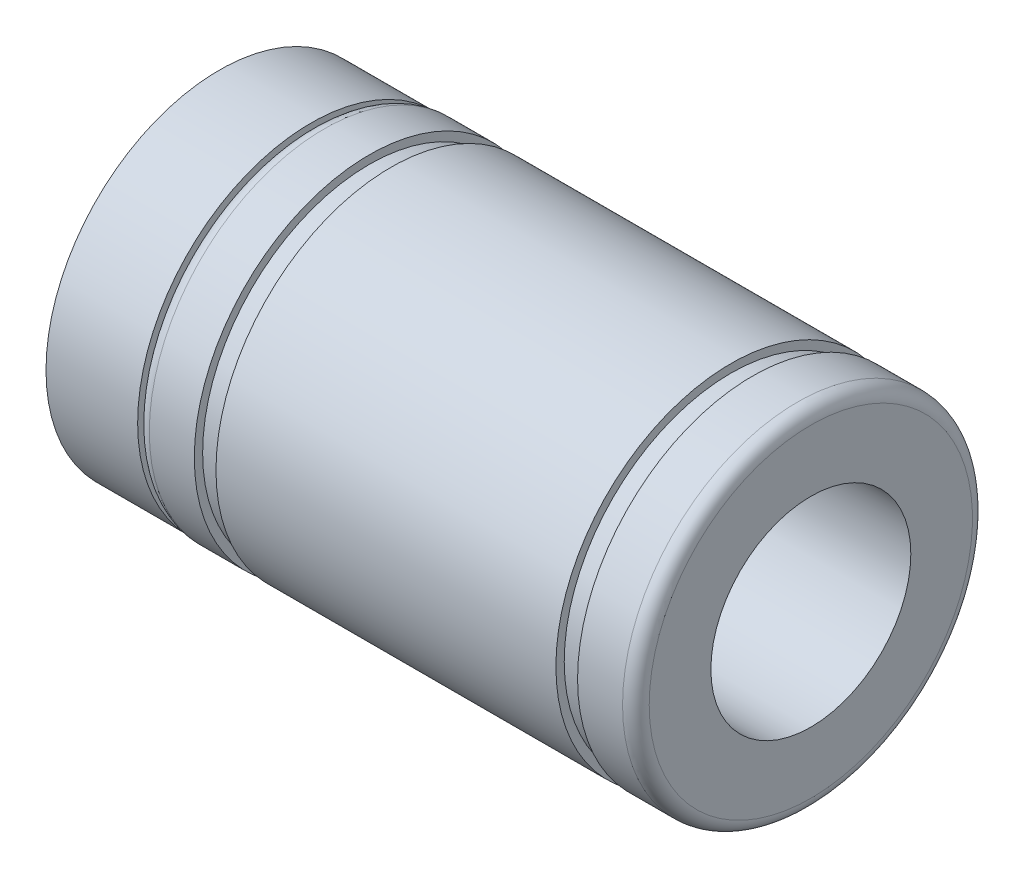
ISO-10303-21;
HEADER;
FILE_DESCRIPTION(('STEP AP214'),'2;1');
FILE_NAME('part.step','',(''),(''),'','','');
FILE_SCHEMA(('AUTOMOTIVE_DESIGN { 1 0 10303 214 1 1 1 1 }'));
ENDSEC;
DATA;
#1=APPLICATION_CONTEXT('core data for automotive mechanical design processes');
#2=APPLICATION_PROTOCOL_DEFINITION('international standard','automotive_design',2000,#1);
#3=PRODUCT_CONTEXT('',#1,'mechanical');
#4=PRODUCT('Part','Part','',(#3));
#5=PRODUCT_RELATED_PRODUCT_CATEGORY('part','',(#4));
#6=PRODUCT_DEFINITION_FORMATION('','',#4);
#7=PRODUCT_DEFINITION_CONTEXT('part definition',#1,'design');
#8=PRODUCT_DEFINITION('design','',#6,#7);
#9=PRODUCT_DEFINITION_SHAPE('','',#8);
#10=(LENGTH_UNIT() NAMED_UNIT(*) SI_UNIT(.MILLI.,.METRE.));
#11=(NAMED_UNIT(*) PLANE_ANGLE_UNIT() SI_UNIT($,.RADIAN.));
#12=(NAMED_UNIT(*) SI_UNIT($,.STERADIAN.) SOLID_ANGLE_UNIT());
#13=UNCERTAINTY_MEASURE_WITH_UNIT(LENGTH_MEASURE(1.E-05),#10,'distance_accuracy_value','');
#14=(GEOMETRIC_REPRESENTATION_CONTEXT(3) GLOBAL_UNCERTAINTY_ASSIGNED_CONTEXT((#13)) GLOBAL_UNIT_ASSIGNED_CONTEXT((#10,
#11,#12)) REPRESENTATION_CONTEXT('',''));
#15=CARTESIAN_POINT('',(0.,0.,0.));
#16=DIRECTION('',(0.,0.,1.));
#17=DIRECTION('',(1.,0.,0.));
#18=AXIS2_PLACEMENT_3D('',#15,#16,#17);
#19=CARTESIAN_POINT('',(-14.1999999999992,0.,0.));
#20=DIRECTION('',(-1.,0.,0.));
#21=DIRECTION('',(0.,0.,1.));
#22=AXIS2_PLACEMENT_3D('',#19,#20,#21);
#23=TOROIDAL_SURFACE('',#22,9.69999999999919,0.800000000000811);
#24=CARTESIAN_POINT('',(-15.,0.,0.));
#25=DIRECTION('',(-1.,0.,0.));
#26=DIRECTION('',(0.,0.,1.));
#27=AXIS2_PLACEMENT_3D('',#24,#25,#26);
#28=CIRCLE('',#27,9.7);
#29=CARTESIAN_POINT('',(-15.,0.,9.7));
#30=VERTEX_POINT('',#29);
#31=EDGE_CURVE('E10',#30,#30,#28,.T.);
#32=ORIENTED_EDGE('',*,*,#31,.F.);
#33=EDGE_LOOP('',(#32));
#34=FACE_BOUND('',#33,.T.);
#35=CARTESIAN_POINT('',(-14.2,0.,0.));
#36=DIRECTION('',(-1.,0.,0.));
#37=DIRECTION('',(0.,0.,1.));
#38=AXIS2_PLACEMENT_3D('',#35,#36,#37);
#39=CIRCLE('',#38,10.5);
#40=CARTESIAN_POINT('',(-14.2,0.,10.5));
#41=VERTEX_POINT('',#40);
#42=EDGE_CURVE('E74',#41,#41,#39,.T.);
#43=ORIENTED_EDGE('',*,*,#42,.T.);
#44=EDGE_LOOP('',(#43));
#45=FACE_BOUND('',#44,.T.);
#46=ADVANCED_FACE('F31',(#34,#45),#23,.T.);
#47=CARTESIAN_POINT('',(15.,0.,0.));
#48=DIRECTION('',(-1.,0.,0.));
#49=DIRECTION('',(0.,0.,1.));
#50=AXIS2_PLACEMENT_3D('',#47,#48,#49);
#51=CYLINDRICAL_SURFACE('',#50,6.);
#52=CARTESIAN_POINT('',(15.,0.,0.));
#53=DIRECTION('',(-1.,0.,0.));
#54=DIRECTION('',(0.,0.,1.));
#55=AXIS2_PLACEMENT_3D('',#52,#53,#54);
#56=CIRCLE('',#55,6.);
#57=CARTESIAN_POINT('',(15.,0.,6.));
#58=VERTEX_POINT('',#57);
#59=EDGE_CURVE('E37',#58,#58,#56,.T.);
#60=ORIENTED_EDGE('',*,*,#59,.F.);
#61=EDGE_LOOP('',(#60));
#62=FACE_BOUND('',#61,.T.);
#63=CARTESIAN_POINT('',(-20.5,0.,0.));
#64=DIRECTION('',(-1.,0.,0.));
#65=DIRECTION('',(0.,0.,1.));
#66=AXIS2_PLACEMENT_3D('',#63,#64,#65);
#67=CIRCLE('',#66,6.);
#68=CARTESIAN_POINT('',(-20.5,0.,6.));
#69=VERTEX_POINT('',#68);
#70=EDGE_CURVE('E77',#69,#69,#67,.T.);
#71=ORIENTED_EDGE('',*,*,#70,.T.);
#72=EDGE_LOOP('',(#71));
#73=FACE_BOUND('',#72,.T.);
#74=ADVANCED_FACE('F109',(#62,#73),#51,.F.);
#75=CARTESIAN_POINT('',(15.,6.,0.));
#76=DIRECTION('',(-1.,0.,0.));
#77=DIRECTION('',(0.,0.,1.));
#78=AXIS2_PLACEMENT_3D('',#75,#76,#77);
#79=PLANE('',#78);
#80=CARTESIAN_POINT('',(15.,0.,0.));
#81=DIRECTION('',(-1.,0.,0.));
#82=DIRECTION('',(0.,0.,1.));
#83=AXIS2_PLACEMENT_3D('',#80,#81,#82);
#84=CIRCLE('',#83,9.7);
#85=CARTESIAN_POINT('',(15.,0.,9.7));
#86=VERTEX_POINT('',#85);
#87=EDGE_CURVE('E41',#86,#86,#84,.T.);
#88=ORIENTED_EDGE('',*,*,#87,.F.);
#89=EDGE_LOOP('',(#88));
#90=FACE_BOUND('',#89,.T.);
#91=ORIENTED_EDGE('',*,*,#59,.T.);
#92=EDGE_LOOP('',(#91));
#93=FACE_BOUND('',#92,.T.);
#94=ADVANCED_FACE('F114',(#90,#93),#79,.F.);
#95=CARTESIAN_POINT('',(14.1999999999992,0.,0.));
#96=DIRECTION('',(-1.,0.,0.));
#97=DIRECTION('',(0.,0.,1.));
#98=AXIS2_PLACEMENT_3D('',#95,#96,#97);
#99=TOROIDAL_SURFACE('',#98,9.69999999999919,0.800000000000815);
#100=CARTESIAN_POINT('',(14.2,0.,0.));
#101=DIRECTION('',(-1.,0.,0.));
#102=DIRECTION('',(0.,0.,1.));
#103=AXIS2_PLACEMENT_3D('',#100,#101,#102);
#104=CIRCLE('',#103,10.5);
#105=CARTESIAN_POINT('',(14.2,0.,10.5));
#106=VERTEX_POINT('',#105);
#107=EDGE_CURVE('E45',#106,#106,#104,.T.);
#108=ORIENTED_EDGE('',*,*,#107,.F.);
#109=EDGE_LOOP('',(#108));
#110=FACE_BOUND('',#109,.T.);
#111=ORIENTED_EDGE('',*,*,#87,.T.);
#112=EDGE_LOOP('',(#111));
#113=FACE_BOUND('',#112,.T.);
#114=ADVANCED_FACE('F165',(#110,#113),#99,.T.);
#115=CARTESIAN_POINT('',(15.,0.,0.));
#116=DIRECTION('',(-1.,0.,0.));
#117=DIRECTION('',(0.,0.,1.));
#118=AXIS2_PLACEMENT_3D('',#115,#116,#117);
#119=CYLINDRICAL_SURFACE('',#118,10.5);
#120=CARTESIAN_POINT('',(11.5,0.,0.));
#121=DIRECTION('',(-1.,0.,0.));
#122=DIRECTION('',(0.,0.,1.));
#123=AXIS2_PLACEMENT_3D('',#120,#121,#122);
#124=CIRCLE('',#123,10.5);
#125=CARTESIAN_POINT('',(11.5,0.,10.5));
#126=VERTEX_POINT('',#125);
#127=EDGE_CURVE('E50',#126,#126,#124,.T.);
#128=ORIENTED_EDGE('',*,*,#127,.F.);
#129=EDGE_LOOP('',(#128));
#130=FACE_BOUND('',#129,.T.);
#131=ORIENTED_EDGE('',*,*,#107,.T.);
#132=EDGE_LOOP('',(#131));
#133=FACE_BOUND('',#132,.T.);
#134=ADVANCED_FACE('F159',(#130,#133),#119,.T.);
#135=CARTESIAN_POINT('',(11.5,10.5,0.));
#136=DIRECTION('',(1.,0.,0.));
#137=DIRECTION('',(0.,0.,-1.));
#138=AXIS2_PLACEMENT_3D('',#135,#136,#137);
#139=PLANE('',#138);
#140=CARTESIAN_POINT('',(11.5,0.,0.));
#141=DIRECTION('',(-1.,0.,0.));
#142=DIRECTION('',(0.,0.,1.));
#143=AXIS2_PLACEMENT_3D('',#140,#141,#142);
#144=CIRCLE('',#143,10.);
#145=CARTESIAN_POINT('',(11.5,0.,10.));
#146=VERTEX_POINT('',#145);
#147=EDGE_CURVE('E53',#146,#146,#144,.T.);
#148=ORIENTED_EDGE('',*,*,#147,.F.);
#149=EDGE_LOOP('',(#148));
#150=FACE_BOUND('',#149,.T.);
#151=ORIENTED_EDGE('',*,*,#127,.T.);
#152=EDGE_LOOP('',(#151));
#153=FACE_BOUND('',#152,.T.);
#154=ADVANCED_FACE('F153',(#150,#153),#139,.F.);
#155=CARTESIAN_POINT('',(15.,0.,0.));
#156=DIRECTION('',(-1.,0.,0.));
#157=DIRECTION('',(0.,0.,1.));
#158=AXIS2_PLACEMENT_3D('',#155,#156,#157);
#159=CYLINDRICAL_SURFACE('',#158,10.);
#160=CARTESIAN_POINT('',(10.2,0.,0.));
#161=DIRECTION('',(-1.,0.,0.));
#162=DIRECTION('',(0.,0.,1.));
#163=AXIS2_PLACEMENT_3D('',#160,#161,#162);
#164=CIRCLE('',#163,10.);
#165=CARTESIAN_POINT('',(10.2,0.,10.));
#166=VERTEX_POINT('',#165);
#167=EDGE_CURVE('E56',#166,#166,#164,.T.);
#168=ORIENTED_EDGE('',*,*,#167,.F.);
#169=EDGE_LOOP('',(#168));
#170=FACE_BOUND('',#169,.T.);
#171=ORIENTED_EDGE('',*,*,#147,.T.);
#172=EDGE_LOOP('',(#171));
#173=FACE_BOUND('',#172,.T.);
#174=ADVANCED_FACE('F147',(#170,#173),#159,.T.);
#175=CARTESIAN_POINT('',(10.2,10.,0.));
#176=DIRECTION('',(-1.,0.,0.));
#177=DIRECTION('',(0.,0.,1.));
#178=AXIS2_PLACEMENT_3D('',#175,#176,#177);
#179=PLANE('',#178);
#180=CARTESIAN_POINT('',(10.2,0.,0.));
#181=DIRECTION('',(-1.,0.,0.));
#182=DIRECTION('',(0.,0.,1.));
#183=AXIS2_PLACEMENT_3D('',#180,#181,#182);
#184=CIRCLE('',#183,10.5);
#185=CARTESIAN_POINT('',(10.2,0.,10.5));
#186=VERTEX_POINT('',#185);
#187=EDGE_CURVE('E59',#186,#186,#184,.T.);
#188=ORIENTED_EDGE('',*,*,#187,.F.);
#189=EDGE_LOOP('',(#188));
#190=FACE_BOUND('',#189,.T.);
#191=ORIENTED_EDGE('',*,*,#167,.T.);
#192=EDGE_LOOP('',(#191));
#193=FACE_BOUND('',#192,.T.);
#194=ADVANCED_FACE('F141',(#190,#193),#179,.F.);
#195=CARTESIAN_POINT('',(15.,0.,0.));
#196=DIRECTION('',(-1.,0.,0.));
#197=DIRECTION('',(0.,0.,1.));
#198=AXIS2_PLACEMENT_3D('',#195,#196,#197);
#199=CYLINDRICAL_SURFACE('',#198,10.5);
#200=CARTESIAN_POINT('',(-10.2,0.,0.));
#201=DIRECTION('',(-1.,0.,0.));
#202=DIRECTION('',(0.,0.,1.));
#203=AXIS2_PLACEMENT_3D('',#200,#201,#202);
#204=CIRCLE('',#203,10.5);
#205=CARTESIAN_POINT('',(-10.2,0.,10.5));
#206=VERTEX_POINT('',#205);
#207=EDGE_CURVE('E62',#206,#206,#204,.T.);
#208=ORIENTED_EDGE('',*,*,#207,.F.);
#209=EDGE_LOOP('',(#208));
#210=FACE_BOUND('',#209,.T.);
#211=ORIENTED_EDGE('',*,*,#187,.T.);
#212=EDGE_LOOP('',(#211));
#213=FACE_BOUND('',#212,.T.);
#214=ADVANCED_FACE('F135',(#210,#213),#199,.T.);
#215=CARTESIAN_POINT('',(-10.2,10.5,0.));
#216=DIRECTION('',(1.,0.,0.));
#217=DIRECTION('',(0.,0.,-1.));
#218=AXIS2_PLACEMENT_3D('',#215,#216,#217);
#219=PLANE('',#218);
#220=CARTESIAN_POINT('',(-10.2,0.,0.));
#221=DIRECTION('',(-1.,0.,0.));
#222=DIRECTION('',(0.,0.,1.));
#223=AXIS2_PLACEMENT_3D('',#220,#221,#222);
#224=CIRCLE('',#223,10.);
#225=CARTESIAN_POINT('',(-10.2,0.,10.));
#226=VERTEX_POINT('',#225);
#227=EDGE_CURVE('E65',#226,#226,#224,.T.);
#228=ORIENTED_EDGE('',*,*,#227,.F.);
#229=EDGE_LOOP('',(#228));
#230=FACE_BOUND('',#229,.T.);
#231=ORIENTED_EDGE('',*,*,#207,.T.);
#232=EDGE_LOOP('',(#231));
#233=FACE_BOUND('',#232,.T.);
#234=ADVANCED_FACE('F129',(#230,#233),#219,.F.);
#235=CARTESIAN_POINT('',(15.,0.,0.));
#236=DIRECTION('',(-1.,0.,0.));
#237=DIRECTION('',(0.,0.,1.));
#238=AXIS2_PLACEMENT_3D('',#235,#236,#237);
#239=CYLINDRICAL_SURFACE('',#238,10.);
#240=CARTESIAN_POINT('',(-11.5,0.,0.));
#241=DIRECTION('',(-1.,0.,0.));
#242=DIRECTION('',(0.,0.,1.));
#243=AXIS2_PLACEMENT_3D('',#240,#241,#242);
#244=CIRCLE('',#243,10.);
#245=CARTESIAN_POINT('',(-11.5,0.,10.));
#246=VERTEX_POINT('',#245);
#247=EDGE_CURVE('E68',#246,#246,#244,.T.);
#248=ORIENTED_EDGE('',*,*,#247,.F.);
#249=EDGE_LOOP('',(#248));
#250=FACE_BOUND('',#249,.T.);
#251=ORIENTED_EDGE('',*,*,#227,.T.);
#252=EDGE_LOOP('',(#251));
#253=FACE_BOUND('',#252,.T.);
#254=ADVANCED_FACE('F123',(#250,#253),#239,.T.);
#255=CARTESIAN_POINT('',(-11.5,10.,0.));
#256=DIRECTION('',(-1.,0.,0.));
#257=DIRECTION('',(0.,0.,1.));
#258=AXIS2_PLACEMENT_3D('',#255,#256,#257);
#259=PLANE('',#258);
#260=CARTESIAN_POINT('',(-11.5,0.,0.));
#261=DIRECTION('',(-1.,0.,0.));
#262=DIRECTION('',(0.,0.,1.));
#263=AXIS2_PLACEMENT_3D('',#260,#261,#262);
#264=CIRCLE('',#263,10.5);
#265=CARTESIAN_POINT('',(-11.5,0.,10.5));
#266=VERTEX_POINT('',#265);
#267=EDGE_CURVE('E71',#266,#266,#264,.T.);
#268=ORIENTED_EDGE('',*,*,#267,.F.);
#269=EDGE_LOOP('',(#268));
#270=FACE_BOUND('',#269,.T.);
#271=ORIENTED_EDGE('',*,*,#247,.T.);
#272=EDGE_LOOP('',(#271));
#273=FACE_BOUND('',#272,.T.);
#274=ADVANCED_FACE('F105',(#270,#273),#259,.F.);
#275=CARTESIAN_POINT('',(15.,0.,0.));
#276=DIRECTION('',(-1.,0.,0.));
#277=DIRECTION('',(0.,0.,1.));
#278=AXIS2_PLACEMENT_3D('',#275,#276,#277);
#279=CYLINDRICAL_SURFACE('',#278,10.5);
#280=ORIENTED_EDGE('',*,*,#42,.F.);
#281=EDGE_LOOP('',(#280));
#282=FACE_BOUND('',#281,.T.);
#283=ORIENTED_EDGE('',*,*,#267,.T.);
#284=EDGE_LOOP('',(#283));
#285=FACE_BOUND('',#284,.T.);
#286=ADVANCED_FACE('F97',(#282,#285),#279,.T.);
#287=CARTESIAN_POINT('',(-15.,6.,0.));
#288=DIRECTION('',(-1.,0.,0.));
#289=DIRECTION('',(0.,0.,1.));
#290=AXIS2_PLACEMENT_3D('',#287,#288,#289);
#291=PLANE('',#290);
#292=CARTESIAN_POINT('',(-15.,0.,0.));
#293=DIRECTION('',(-1.,0.,0.));
#294=DIRECTION('',(0.,0.,1.));
#295=AXIS2_PLACEMENT_3D('',#292,#293,#294);
#296=CIRCLE('',#295,10.4);
#297=CARTESIAN_POINT('',(-15.,0.,10.4));
#298=VERTEX_POINT('',#297);
#299=EDGE_CURVE('E80',#298,#298,#296,.T.);
#300=ORIENTED_EDGE('',*,*,#299,.F.);
#301=EDGE_LOOP('',(#300));
#302=FACE_BOUND('',#301,.T.);
#303=ORIENTED_EDGE('',*,*,#31,.T.);
#304=EDGE_LOOP('',(#303));
#305=FACE_BOUND('',#304,.T.);
#306=ADVANCED_FACE('F95',(#302,#305),#291,.F.);
#307=CARTESIAN_POINT('',(-20.5,10.4,0.));
#308=DIRECTION('',(1.,0.,0.));
#309=DIRECTION('',(0.,0.,-1.));
#310=AXIS2_PLACEMENT_3D('',#307,#308,#309);
#311=PLANE('',#310);
#312=ORIENTED_EDGE('',*,*,#70,.F.);
#313=EDGE_LOOP('',(#312));
#314=FACE_BOUND('',#313,.T.);
#315=CARTESIAN_POINT('',(-20.5,0.,0.));
#316=DIRECTION('',(-1.,0.,0.));
#317=DIRECTION('',(0.,0.,1.));
#318=AXIS2_PLACEMENT_3D('',#315,#316,#317);
#319=CIRCLE('',#318,10.4);
#320=CARTESIAN_POINT('',(-20.5,0.,10.4));
#321=VERTEX_POINT('',#320);
#322=EDGE_CURVE('E83',#321,#321,#319,.T.);
#323=ORIENTED_EDGE('',*,*,#322,.T.);
#324=EDGE_LOOP('',(#323));
#325=FACE_BOUND('',#324,.T.);
#326=ADVANCED_FACE('F87',(#314,#325),#311,.F.);
#327=CARTESIAN_POINT('',(-15.,0.,0.));
#328=DIRECTION('',(-1.,0.,0.));
#329=DIRECTION('',(0.,0.,1.));
#330=AXIS2_PLACEMENT_3D('',#327,#328,#329);
#331=CYLINDRICAL_SURFACE('',#330,10.4);
#332=ORIENTED_EDGE('',*,*,#322,.F.);
#333=EDGE_LOOP('',(#332));
#334=FACE_BOUND('',#333,.T.);
#335=ORIENTED_EDGE('',*,*,#299,.T.);
#336=EDGE_LOOP('',(#335));
#337=FACE_BOUND('',#336,.T.);
#338=ADVANCED_FACE('F89',(#334,#337),#331,.T.);
#339=CLOSED_SHELL('',(#46,#74,#94,#114,#134,#154,#174,#194,#214,#234,#254,#274,#286,#306,#326,#338));
#340=MANIFOLD_SOLID_BREP('B2',#339);
#341=ADVANCED_BREP_SHAPE_REPRESENTATION('',(#18,#340),#14);
#342=SHAPE_DEFINITION_REPRESENTATION(#9,#341);
ENDSEC;
END-ISO-10303-21;
